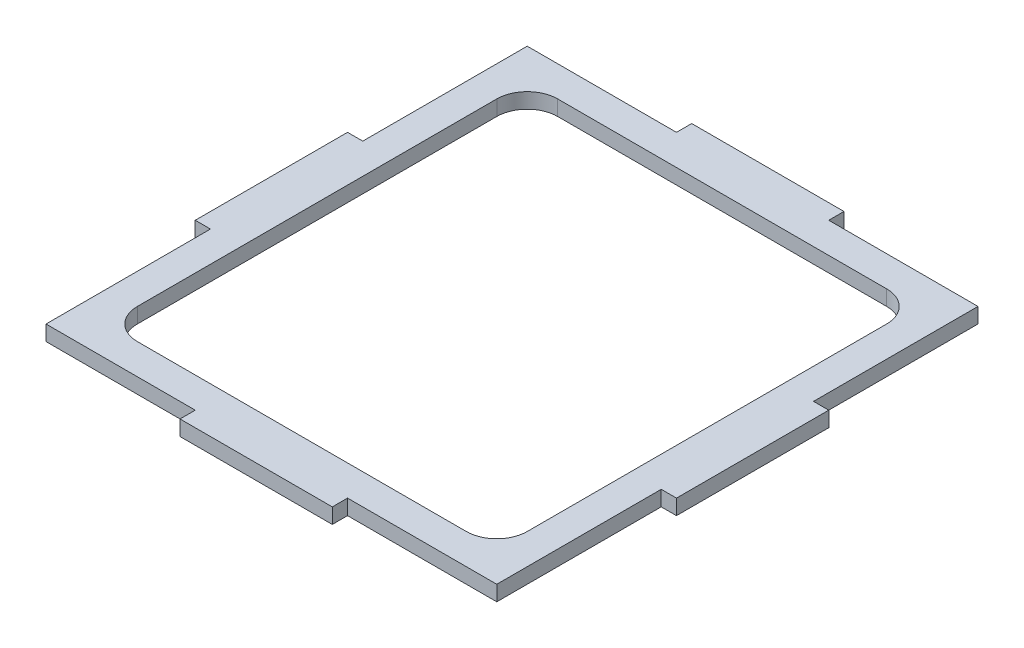
ISO-10303-21;
HEADER;
FILE_DESCRIPTION(('STEP AP214'),'2;1');
FILE_NAME('part.step','',(''),(''),'','','');
FILE_SCHEMA(('AUTOMOTIVE_DESIGN { 1 0 10303 214 1 1 1 1 }'));
ENDSEC;
DATA;
#1=APPLICATION_CONTEXT('core data for automotive mechanical design processes');
#2=APPLICATION_PROTOCOL_DEFINITION('international standard','automotive_design',2000,#1);
#3=PRODUCT_CONTEXT('',#1,'mechanical');
#4=PRODUCT('Part','Part','',(#3));
#5=PRODUCT_RELATED_PRODUCT_CATEGORY('part','',(#4));
#6=PRODUCT_DEFINITION_FORMATION('','',#4);
#7=PRODUCT_DEFINITION_CONTEXT('part definition',#1,'design');
#8=PRODUCT_DEFINITION('design','',#6,#7);
#9=PRODUCT_DEFINITION_SHAPE('','',#8);
#10=(LENGTH_UNIT() NAMED_UNIT(*) SI_UNIT(.MILLI.,.METRE.));
#11=(NAMED_UNIT(*) PLANE_ANGLE_UNIT() SI_UNIT($,.RADIAN.));
#12=(NAMED_UNIT(*) SI_UNIT($,.STERADIAN.) SOLID_ANGLE_UNIT());
#13=UNCERTAINTY_MEASURE_WITH_UNIT(LENGTH_MEASURE(1.E-05),#10,'distance_accuracy_value','');
#14=(GEOMETRIC_REPRESENTATION_CONTEXT(3) GLOBAL_UNCERTAINTY_ASSIGNED_CONTEXT((#13)) GLOBAL_UNIT_ASSIGNED_CONTEXT((#10,
#11,#12)) REPRESENTATION_CONTEXT('',''));
#15=CARTESIAN_POINT('',(0.,0.,0.));
#16=DIRECTION('',(0.,0.,1.));
#17=DIRECTION('',(1.,0.,0.));
#18=AXIS2_PLACEMENT_3D('',#15,#16,#17);
#19=CARTESIAN_POINT('',(-74.,5.,-79.));
#20=DIRECTION('',(0.,0.,1.));
#21=DIRECTION('',(1.,0.,0.));
#22=AXIS2_PLACEMENT_3D('',#19,#20,#21);
#23=PLANE('',#22);
#24=DIRECTION('',(-1.,0.,0.));
#25=VECTOR('',#24,1.);
#26=CARTESIAN_POINT('',(-74.,0.,-79.));
#27=LINE('',#26,#25);
#28=CARTESIAN_POINT('',(74.,0.,-79.));
#29=VERTEX_POINT('',#28);
#30=CARTESIAN_POINT('',(25.,0.,-79.));
#31=VERTEX_POINT('',#30);
#32=EDGE_CURVE('E346',#29,#31,#27,.T.);
#33=ORIENTED_EDGE('',*,*,#32,.T.);
#34=DIRECTION('',(0.,1.,0.));
#35=VECTOR('',#34,1.);
#36=CARTESIAN_POINT('',(25.,5.,-79.));
#37=LINE('',#36,#35);
#38=CARTESIAN_POINT('',(25.,5.,-79.));
#39=VERTEX_POINT('',#38);
#40=EDGE_CURVE('E225',#31,#39,#37,.T.);
#41=ORIENTED_EDGE('',*,*,#40,.T.);
#42=DIRECTION('',(-1.,0.,0.));
#43=VECTOR('',#42,1.);
#44=CARTESIAN_POINT('',(-74.,5.,-79.));
#45=LINE('',#44,#43);
#46=CARTESIAN_POINT('',(74.,5.,-79.));
#47=VERTEX_POINT('',#46);
#48=EDGE_CURVE('E330',#47,#39,#45,.T.);
#49=ORIENTED_EDGE('',*,*,#48,.F.);
#50=DIRECTION('',(0.,-1.,0.));
#51=VECTOR('',#50,1.);
#52=CARTESIAN_POINT('',(74.,5.,-79.));
#53=LINE('',#52,#51);
#54=EDGE_CURVE('E364',#47,#29,#53,.T.);
#55=ORIENTED_EDGE('',*,*,#54,.T.);
#56=EDGE_LOOP('',(#33,#41,#49,#55));
#57=FACE_BOUND('',#56,.T.);
#58=ADVANCED_FACE('F33',(#57),#23,.F.);
#59=CARTESIAN_POINT('',(-74.,5.,79.));
#60=DIRECTION('',(0.,0.,-1.));
#61=DIRECTION('',(-1.,0.,0.));
#62=AXIS2_PLACEMENT_3D('',#59,#60,#61);
#63=PLANE('',#62);
#64=DIRECTION('',(1.,0.,0.));
#65=VECTOR('',#64,1.);
#66=CARTESIAN_POINT('',(-74.,5.,79.));
#67=LINE('',#66,#65);
#68=CARTESIAN_POINT('',(25.,5.,79.));
#69=VERTEX_POINT('',#68);
#70=CARTESIAN_POINT('',(74.,5.,79.));
#71=VERTEX_POINT('',#70);
#72=EDGE_CURVE('E337',#69,#71,#67,.T.);
#73=ORIENTED_EDGE('',*,*,#72,.F.);
#74=DIRECTION('',(0.,-1.,0.));
#75=VECTOR('',#74,1.);
#76=CARTESIAN_POINT('',(25.,5.,79.));
#77=LINE('',#76,#75);
#78=CARTESIAN_POINT('',(25.,0.,79.));
#79=VERTEX_POINT('',#78);
#80=EDGE_CURVE('E274',#69,#79,#77,.T.);
#81=ORIENTED_EDGE('',*,*,#80,.T.);
#82=DIRECTION('',(1.,0.,0.));
#83=VECTOR('',#82,1.);
#84=CARTESIAN_POINT('',(-74.,0.,79.));
#85=LINE('',#84,#83);
#86=CARTESIAN_POINT('',(74.,0.,79.));
#87=VERTEX_POINT('',#86);
#88=EDGE_CURVE('E352',#79,#87,#85,.T.);
#89=ORIENTED_EDGE('',*,*,#88,.T.);
#90=DIRECTION('',(0.,-1.,0.));
#91=VECTOR('',#90,1.);
#92=CARTESIAN_POINT('',(74.,5.,79.));
#93=LINE('',#92,#91);
#94=EDGE_CURVE('E341',#71,#87,#93,.T.);
#95=ORIENTED_EDGE('',*,*,#94,.F.);
#96=EDGE_LOOP('',(#73,#81,#89,#95));
#97=FACE_BOUND('',#96,.T.);
#98=ADVANCED_FACE('F460',(#97),#63,.F.);
#99=CARTESIAN_POINT('',(74.,5.,79.));
#100=DIRECTION('',(-1.,0.,0.));
#101=DIRECTION('',(0.,0.,1.));
#102=AXIS2_PLACEMENT_3D('',#99,#100,#101);
#103=PLANE('',#102);
#104=DIRECTION('',(0.,0.,-1.));
#105=VECTOR('',#104,1.);
#106=CARTESIAN_POINT('',(74.,5.,79.));
#107=LINE('',#106,#105);
#108=CARTESIAN_POINT('',(74.,5.,-25.));
#109=VERTEX_POINT('',#108);
#110=EDGE_CURVE('E329',#109,#47,#107,.T.);
#111=ORIENTED_EDGE('',*,*,#110,.F.);
#112=DIRECTION('',(0.,-1.,0.));
#113=VECTOR('',#112,1.);
#114=CARTESIAN_POINT('',(74.,5.,-25.));
#115=LINE('',#114,#113);
#116=CARTESIAN_POINT('',(74.,0.,-25.));
#117=VERTEX_POINT('',#116);
#118=EDGE_CURVE('E321',#109,#117,#115,.T.);
#119=ORIENTED_EDGE('',*,*,#118,.T.);
#120=DIRECTION('',(0.,0.,-1.));
#121=VECTOR('',#120,1.);
#122=CARTESIAN_POINT('',(74.,0.,79.));
#123=LINE('',#122,#121);
#124=EDGE_CURVE('E324',#117,#29,#123,.T.);
#125=ORIENTED_EDGE('',*,*,#124,.T.);
#126=ORIENTED_EDGE('',*,*,#54,.F.);
#127=EDGE_LOOP('',(#111,#119,#125,#126));
#128=FACE_BOUND('',#127,.T.);
#129=ADVANCED_FACE('F467',(#128),#103,.F.);
#130=CARTESIAN_POINT('',(-74.,5.,79.));
#131=DIRECTION('',(1.,0.,0.));
#132=DIRECTION('',(0.,0.,-1.));
#133=AXIS2_PLACEMENT_3D('',#130,#131,#132);
#134=PLANE('',#133);
#135=DIRECTION('',(0.,0.,1.));
#136=VECTOR('',#135,1.);
#137=CARTESIAN_POINT('',(-74.,0.,79.));
#138=LINE('',#137,#136);
#139=CARTESIAN_POINT('',(-74.,0.,-79.));
#140=VERTEX_POINT('',#139);
#141=CARTESIAN_POINT('',(-74.,0.,-25.));
#142=VERTEX_POINT('',#141);
#143=EDGE_CURVE('E349',#140,#142,#138,.T.);
#144=ORIENTED_EDGE('',*,*,#143,.T.);
#145=DIRECTION('',(0.,1.,0.));
#146=VECTOR('',#145,1.);
#147=CARTESIAN_POINT('',(-74.,5.,-25.));
#148=LINE('',#147,#146);
#149=CARTESIAN_POINT('',(-74.,5.,-25.));
#150=VERTEX_POINT('',#149);
#151=EDGE_CURVE('E318',#142,#150,#148,.T.);
#152=ORIENTED_EDGE('',*,*,#151,.T.);
#153=DIRECTION('',(0.,0.,1.));
#154=VECTOR('',#153,1.);
#155=CARTESIAN_POINT('',(-74.,5.,79.));
#156=LINE('',#155,#154);
#157=CARTESIAN_POINT('',(-74.,5.,-79.));
#158=VERTEX_POINT('',#157);
#159=EDGE_CURVE('E334',#158,#150,#156,.T.);
#160=ORIENTED_EDGE('',*,*,#159,.F.);
#161=DIRECTION('',(0.,-1.,0.));
#162=VECTOR('',#161,1.);
#163=CARTESIAN_POINT('',(-74.,5.,-79.));
#164=LINE('',#163,#162);
#165=EDGE_CURVE('E361',#158,#140,#164,.T.);
#166=ORIENTED_EDGE('',*,*,#165,.T.);
#167=EDGE_LOOP('',(#144,#152,#160,#166));
#168=FACE_BOUND('',#167,.T.);
#169=ADVANCED_FACE('F481',(#168),#134,.F.);
#170=CARTESIAN_POINT('',(74.,0.,25.));
#171=VERTEX_POINT('',#170);
#172=EDGE_CURVE('E342',#87,#171,#123,.T.);
#173=ORIENTED_EDGE('',*,*,#172,.T.);
#174=DIRECTION('',(0.,1.,0.));
#175=VECTOR('',#174,1.);
#176=CARTESIAN_POINT('',(74.,5.,25.));
#177=LINE('',#176,#175);
#178=CARTESIAN_POINT('',(74.,5.,25.));
#179=VERTEX_POINT('',#178);
#180=EDGE_CURVE('E315',#171,#179,#177,.T.);
#181=ORIENTED_EDGE('',*,*,#180,.T.);
#182=EDGE_CURVE('E325',#71,#179,#107,.T.);
#183=ORIENTED_EDGE('',*,*,#182,.F.);
#184=ORIENTED_EDGE('',*,*,#94,.T.);
#185=EDGE_LOOP('',(#173,#181,#183,#184));
#186=FACE_BOUND('',#185,.T.);
#187=ADVANCED_FACE('F474',(#186),#103,.F.);
#188=CARTESIAN_POINT('',(-25.,5.,-79.));
#189=VERTEX_POINT('',#188);
#190=EDGE_CURVE('E328',#189,#158,#45,.T.);
#191=ORIENTED_EDGE('',*,*,#190,.F.);
#192=DIRECTION('',(0.,-1.,0.));
#193=VECTOR('',#192,1.);
#194=CARTESIAN_POINT('',(-25.,5.,-79.));
#195=LINE('',#194,#193);
#196=CARTESIAN_POINT('',(-25.,0.,-79.));
#197=VERTEX_POINT('',#196);
#198=EDGE_CURVE('E271',#189,#197,#195,.T.);
#199=ORIENTED_EDGE('',*,*,#198,.T.);
#200=EDGE_CURVE('E345',#197,#140,#27,.T.);
#201=ORIENTED_EDGE('',*,*,#200,.T.);
#202=ORIENTED_EDGE('',*,*,#165,.F.);
#203=EDGE_LOOP('',(#191,#199,#201,#202));
#204=FACE_BOUND('',#203,.T.);
#205=ADVANCED_FACE('F463',(#204),#23,.F.);
#206=CARTESIAN_POINT('',(-74.,5.,25.));
#207=VERTEX_POINT('',#206);
#208=CARTESIAN_POINT('',(-74.,5.,79.));
#209=VERTEX_POINT('',#208);
#210=EDGE_CURVE('E333',#207,#209,#156,.T.);
#211=ORIENTED_EDGE('',*,*,#210,.F.);
#212=DIRECTION('',(0.,-1.,0.));
#213=VECTOR('',#212,1.);
#214=CARTESIAN_POINT('',(-74.,5.,25.));
#215=LINE('',#214,#213);
#216=CARTESIAN_POINT('',(-74.,0.,25.));
#217=VERTEX_POINT('',#216);
#218=EDGE_CURVE('E306',#207,#217,#215,.T.);
#219=ORIENTED_EDGE('',*,*,#218,.T.);
#220=CARTESIAN_POINT('',(-74.,0.,79.));
#221=VERTEX_POINT('',#220);
#222=EDGE_CURVE('E348',#217,#221,#138,.T.);
#223=ORIENTED_EDGE('',*,*,#222,.T.);
#224=DIRECTION('',(0.,-1.,0.));
#225=VECTOR('',#224,1.);
#226=CARTESIAN_POINT('',(-74.,5.,79.));
#227=LINE('',#226,#225);
#228=EDGE_CURVE('E358',#209,#221,#227,.T.);
#229=ORIENTED_EDGE('',*,*,#228,.F.);
#230=EDGE_LOOP('',(#211,#219,#223,#229));
#231=FACE_BOUND('',#230,.T.);
#232=ADVANCED_FACE('F473',(#231),#134,.F.);
#233=CARTESIAN_POINT('',(-25.,0.,79.));
#234=VERTEX_POINT('',#233);
#235=EDGE_CURVE('E353',#221,#234,#85,.T.);
#236=ORIENTED_EDGE('',*,*,#235,.T.);
#237=DIRECTION('',(0.,1.,0.));
#238=VECTOR('',#237,1.);
#239=CARTESIAN_POINT('',(-25.,5.,79.));
#240=LINE('',#239,#238);
#241=CARTESIAN_POINT('',(-25.,5.,79.));
#242=VERTEX_POINT('',#241);
#243=EDGE_CURVE('E264',#234,#242,#240,.T.);
#244=ORIENTED_EDGE('',*,*,#243,.T.);
#245=EDGE_CURVE('E338',#209,#242,#67,.T.);
#246=ORIENTED_EDGE('',*,*,#245,.F.);
#247=ORIENTED_EDGE('',*,*,#228,.T.);
#248=EDGE_LOOP('',(#236,#244,#246,#247));
#249=FACE_BOUND('',#248,.T.);
#250=ADVANCED_FACE('F470',(#249),#63,.F.);
#251=CARTESIAN_POINT('',(0.,5.,0.));
#252=DIRECTION('',(0.,-1.,0.));
#253=DIRECTION('',(0.,0.,-1.));
#254=AXIS2_PLACEMENT_3D('',#251,#252,#253);
#255=PLANE('',#254);
#256=DIRECTION('',(0.,0.,-1.));
#257=VECTOR('',#256,1.);
#258=CARTESIAN_POINT('',(64.,5.,69.));
#259=LINE('',#258,#257);
#260=CARTESIAN_POINT('',(64.,5.,59.));
#261=VERTEX_POINT('',#260);
#262=CARTESIAN_POINT('',(64.,5.,-59.));
#263=VERTEX_POINT('',#262);
#264=EDGE_CURVE('E409',#261,#263,#259,.T.);
#265=ORIENTED_EDGE('',*,*,#264,.F.);
#266=CARTESIAN_POINT('',(54.,5.,59.));
#267=DIRECTION('',(0.,-1.,0.));
#268=DIRECTION('',(0.,0.,-1.));
#269=AXIS2_PLACEMENT_3D('',#266,#267,#268);
#270=CIRCLE('',#269,10.);
#271=CARTESIAN_POINT('',(54.,5.,69.));
#272=VERTEX_POINT('',#271);
#273=EDGE_CURVE('E390',#261,#272,#270,.T.);
#274=ORIENTED_EDGE('',*,*,#273,.T.);
#275=DIRECTION('',(1.,0.,0.));
#276=VECTOR('',#275,1.);
#277=CARTESIAN_POINT('',(64.,5.,69.));
#278=LINE('',#277,#276);
#279=CARTESIAN_POINT('',(-54.,5.,69.));
#280=VERTEX_POINT('',#279);
#281=EDGE_CURVE('E425',#280,#272,#278,.T.);
#282=ORIENTED_EDGE('',*,*,#281,.F.);
#283=CARTESIAN_POINT('',(-54.,5.,59.));
#284=DIRECTION('',(0.,-1.,0.));
#285=DIRECTION('',(0.,0.,-1.));
#286=AXIS2_PLACEMENT_3D('',#283,#284,#285);
#287=CIRCLE('',#286,10.);
#288=CARTESIAN_POINT('',(-64.,5.,59.));
#289=VERTEX_POINT('',#288);
#290=EDGE_CURVE('E386',#280,#289,#287,.T.);
#291=ORIENTED_EDGE('',*,*,#290,.T.);
#292=DIRECTION('',(0.,0.,1.));
#293=VECTOR('',#292,1.);
#294=CARTESIAN_POINT('',(-64.,5.,69.));
#295=LINE('',#294,#293);
#296=CARTESIAN_POINT('',(-64.,5.,-59.));
#297=VERTEX_POINT('',#296);
#298=EDGE_CURVE('E404',#297,#289,#295,.T.);
#299=ORIENTED_EDGE('',*,*,#298,.F.);
#300=CARTESIAN_POINT('',(-54.,5.,-59.));
#301=DIRECTION('',(0.,-1.,0.));
#302=DIRECTION('',(0.,0.,-1.));
#303=AXIS2_PLACEMENT_3D('',#300,#301,#302);
#304=CIRCLE('',#303,10.);
#305=CARTESIAN_POINT('',(-54.,5.,-69.));
#306=VERTEX_POINT('',#305);
#307=EDGE_CURVE('E41',#297,#306,#304,.T.);
#308=ORIENTED_EDGE('',*,*,#307,.T.);
#309=DIRECTION('',(-1.,0.,0.));
#310=VECTOR('',#309,1.);
#311=CARTESIAN_POINT('',(64.,5.,-69.));
#312=LINE('',#311,#310);
#313=CARTESIAN_POINT('',(54.,5.,-69.));
#314=VERTEX_POINT('',#313);
#315=EDGE_CURVE('E402',#314,#306,#312,.T.);
#316=ORIENTED_EDGE('',*,*,#315,.F.);
#317=CARTESIAN_POINT('',(54.,5.,-59.));
#318=DIRECTION('',(0.,-1.,0.));
#319=DIRECTION('',(0.,0.,-1.));
#320=AXIS2_PLACEMENT_3D('',#317,#318,#319);
#321=CIRCLE('',#320,10.);
#322=EDGE_CURVE('E394',#314,#263,#321,.T.);
#323=ORIENTED_EDGE('',*,*,#322,.T.);
#324=EDGE_LOOP('',(#265,#274,#282,#291,#299,#308,#316,#323));
#325=FACE_BOUND('',#324,.T.);
#326=ORIENTED_EDGE('',*,*,#245,.T.);
#327=DIRECTION('',(0.,0.,1.));
#328=VECTOR('',#327,1.);
#329=CARTESIAN_POINT('',(-25.,5.,84.));
#330=LINE('',#329,#328);
#331=CARTESIAN_POINT('',(-25.,5.,84.));
#332=VERTEX_POINT('',#331);
#333=EDGE_CURVE('E257',#242,#332,#330,.T.);
#334=ORIENTED_EDGE('',*,*,#333,.T.);
#335=DIRECTION('',(1.,0.,0.));
#336=VECTOR('',#335,1.);
#337=CARTESIAN_POINT('',(-25.,5.,84.));
#338=LINE('',#337,#336);
#339=CARTESIAN_POINT('',(25.,5.,84.));
#340=VERTEX_POINT('',#339);
#341=EDGE_CURVE('E231',#332,#340,#338,.T.);
#342=ORIENTED_EDGE('',*,*,#341,.T.);
#343=DIRECTION('',(0.,0.,-1.));
#344=VECTOR('',#343,1.);
#345=CARTESIAN_POINT('',(25.,5.,84.));
#346=LINE('',#345,#344);
#347=EDGE_CURVE('E253',#340,#69,#346,.T.);
#348=ORIENTED_EDGE('',*,*,#347,.T.);
#349=ORIENTED_EDGE('',*,*,#72,.T.);
#350=ORIENTED_EDGE('',*,*,#182,.T.);
#351=DIRECTION('',(1.,0.,0.));
#352=VECTOR('',#351,1.);
#353=CARTESIAN_POINT('',(79.,5.,25.));
#354=LINE('',#353,#352);
#355=CARTESIAN_POINT('',(79.,5.,25.));
#356=VERTEX_POINT('',#355);
#357=EDGE_CURVE('E295',#179,#356,#354,.T.);
#358=ORIENTED_EDGE('',*,*,#357,.T.);
#359=DIRECTION('',(0.,0.,-1.));
#360=VECTOR('',#359,1.);
#361=CARTESIAN_POINT('',(79.,5.,25.));
#362=LINE('',#361,#360);
#363=CARTESIAN_POINT('',(79.,5.,-25.));
#364=VERTEX_POINT('',#363);
#365=EDGE_CURVE('E298',#356,#364,#362,.T.);
#366=ORIENTED_EDGE('',*,*,#365,.T.);
#367=DIRECTION('',(-1.,0.,0.));
#368=VECTOR('',#367,1.);
#369=CARTESIAN_POINT('',(79.,5.,-25.));
#370=LINE('',#369,#368);
#371=EDGE_CURVE('E283',#364,#109,#370,.T.);
#372=ORIENTED_EDGE('',*,*,#371,.T.);
#373=ORIENTED_EDGE('',*,*,#110,.T.);
#374=ORIENTED_EDGE('',*,*,#48,.T.);
#375=CARTESIAN_POINT('',(25.,5.,-84.));
#376=VERTEX_POINT('',#375);
#377=EDGE_CURVE('E255',#39,#376,#346,.T.);
#378=ORIENTED_EDGE('',*,*,#377,.T.);
#379=DIRECTION('',(-1.,0.,0.));
#380=VECTOR('',#379,1.);
#381=CARTESIAN_POINT('',(-25.,5.,-84.));
#382=LINE('',#381,#380);
#383=CARTESIAN_POINT('',(-25.,5.,-84.));
#384=VERTEX_POINT('',#383);
#385=EDGE_CURVE('E238',#376,#384,#382,.T.);
#386=ORIENTED_EDGE('',*,*,#385,.T.);
#387=EDGE_CURVE('E258',#384,#189,#330,.T.);
#388=ORIENTED_EDGE('',*,*,#387,.T.);
#389=ORIENTED_EDGE('',*,*,#190,.T.);
#390=ORIENTED_EDGE('',*,*,#159,.T.);
#391=CARTESIAN_POINT('',(-79.,5.,-25.));
#392=VERTEX_POINT('',#391);
#393=EDGE_CURVE('E301',#150,#392,#370,.T.);
#394=ORIENTED_EDGE('',*,*,#393,.T.);
#395=DIRECTION('',(0.,0.,1.));
#396=VECTOR('',#395,1.);
#397=CARTESIAN_POINT('',(-79.,5.,25.));
#398=LINE('',#397,#396);
#399=CARTESIAN_POINT('',(-79.,5.,25.));
#400=VERTEX_POINT('',#399);
#401=EDGE_CURVE('E278',#392,#400,#398,.T.);
#402=ORIENTED_EDGE('',*,*,#401,.T.);
#403=EDGE_CURVE('E296',#400,#207,#354,.T.);
#404=ORIENTED_EDGE('',*,*,#403,.T.);
#405=ORIENTED_EDGE('',*,*,#210,.T.);
#406=EDGE_LOOP('',(#326,#334,#342,#348,#349,#350,#358,#366,#372,#373,#374,#378,#386,#388,#389,
#390,#394,#402,#404,#405));
#407=FACE_BOUND('',#406,.T.);
#408=ADVANCED_FACE('F400',(#325,#407),#255,.F.);
#409=CARTESIAN_POINT('',(0.,0.,0.));
#410=DIRECTION('',(0.,-1.,0.));
#411=DIRECTION('',(0.,0.,-1.));
#412=AXIS2_PLACEMENT_3D('',#409,#410,#411);
#413=PLANE('',#412);
#414=DIRECTION('',(0.,0.,1.));
#415=VECTOR('',#414,1.);
#416=CARTESIAN_POINT('',(-64.,0.,69.));
#417=LINE('',#416,#415);
#418=CARTESIAN_POINT('',(-64.,0.,-59.));
#419=VERTEX_POINT('',#418);
#420=CARTESIAN_POINT('',(-64.,0.,59.));
#421=VERTEX_POINT('',#420);
#422=EDGE_CURVE('E414',#419,#421,#417,.T.);
#423=ORIENTED_EDGE('',*,*,#422,.T.);
#424=CARTESIAN_POINT('',(-54.,0.,59.));
#425=DIRECTION('',(0.,-1.,0.));
#426=DIRECTION('',(0.,0.,-1.));
#427=AXIS2_PLACEMENT_3D('',#424,#425,#426);
#428=CIRCLE('',#427,10.);
#429=CARTESIAN_POINT('',(-54.,0.,69.));
#430=VERTEX_POINT('',#429);
#431=EDGE_CURVE('E388',#421,#430,#428,.F.);
#432=ORIENTED_EDGE('',*,*,#431,.T.);
#433=DIRECTION('',(1.,0.,0.));
#434=VECTOR('',#433,1.);
#435=CARTESIAN_POINT('',(64.,0.,69.));
#436=LINE('',#435,#434);
#437=CARTESIAN_POINT('',(54.,0.,69.));
#438=VERTEX_POINT('',#437);
#439=EDGE_CURVE('E429',#430,#438,#436,.T.);
#440=ORIENTED_EDGE('',*,*,#439,.T.);
#441=CARTESIAN_POINT('',(54.,0.,59.));
#442=DIRECTION('',(0.,-1.,0.));
#443=DIRECTION('',(0.,0.,-1.));
#444=AXIS2_PLACEMENT_3D('',#441,#442,#443);
#445=CIRCLE('',#444,10.);
#446=CARTESIAN_POINT('',(64.,0.,59.));
#447=VERTEX_POINT('',#446);
#448=EDGE_CURVE('E392',#438,#447,#445,.F.);
#449=ORIENTED_EDGE('',*,*,#448,.T.);
#450=DIRECTION('',(0.,0.,-1.));
#451=VECTOR('',#450,1.);
#452=CARTESIAN_POINT('',(64.,0.,69.));
#453=LINE('',#452,#451);
#454=CARTESIAN_POINT('',(64.,0.,-59.));
#455=VERTEX_POINT('',#454);
#456=EDGE_CURVE('E421',#447,#455,#453,.T.);
#457=ORIENTED_EDGE('',*,*,#456,.T.);
#458=CARTESIAN_POINT('',(54.,0.,-59.));
#459=DIRECTION('',(0.,-1.,0.));
#460=DIRECTION('',(0.,0.,-1.));
#461=AXIS2_PLACEMENT_3D('',#458,#459,#460);
#462=CIRCLE('',#461,10.);
#463=CARTESIAN_POINT('',(54.,0.,-69.));
#464=VERTEX_POINT('',#463);
#465=EDGE_CURVE('E55',#455,#464,#462,.F.);
#466=ORIENTED_EDGE('',*,*,#465,.T.);
#467=DIRECTION('',(-1.,0.,0.));
#468=VECTOR('',#467,1.);
#469=CARTESIAN_POINT('',(64.,0.,-69.));
#470=LINE('',#469,#468);
#471=CARTESIAN_POINT('',(-54.,0.,-69.));
#472=VERTEX_POINT('',#471);
#473=EDGE_CURVE('E416',#464,#472,#470,.T.);
#474=ORIENTED_EDGE('',*,*,#473,.T.);
#475=CARTESIAN_POINT('',(-54.,0.,-59.));
#476=DIRECTION('',(0.,-1.,0.));
#477=DIRECTION('',(0.,0.,-1.));
#478=AXIS2_PLACEMENT_3D('',#475,#476,#477);
#479=CIRCLE('',#478,10.);
#480=EDGE_CURVE('E11',#472,#419,#479,.F.);
#481=ORIENTED_EDGE('',*,*,#480,.T.);
#482=EDGE_LOOP('',(#423,#432,#440,#449,#457,#466,#474,#481));
#483=FACE_BOUND('',#482,.T.);
#484=ORIENTED_EDGE('',*,*,#200,.F.);
#485=DIRECTION('',(0.,0.,1.));
#486=VECTOR('',#485,1.);
#487=CARTESIAN_POINT('',(-25.,0.,84.));
#488=LINE('',#487,#486);
#489=CARTESIAN_POINT('',(-25.,0.,-84.));
#490=VERTEX_POINT('',#489);
#491=EDGE_CURVE('E245',#490,#197,#488,.T.);
#492=ORIENTED_EDGE('',*,*,#491,.F.);
#493=DIRECTION('',(-1.,0.,0.));
#494=VECTOR('',#493,1.);
#495=CARTESIAN_POINT('',(-25.,0.,-84.));
#496=LINE('',#495,#494);
#497=CARTESIAN_POINT('',(25.,0.,-84.));
#498=VERTEX_POINT('',#497);
#499=EDGE_CURVE('E236',#498,#490,#496,.T.);
#500=ORIENTED_EDGE('',*,*,#499,.F.);
#501=DIRECTION('',(0.,0.,-1.));
#502=VECTOR('',#501,1.);
#503=CARTESIAN_POINT('',(25.,0.,84.));
#504=LINE('',#503,#502);
#505=EDGE_CURVE('E219',#31,#498,#504,.T.);
#506=ORIENTED_EDGE('',*,*,#505,.F.);
#507=ORIENTED_EDGE('',*,*,#32,.F.);
#508=ORIENTED_EDGE('',*,*,#124,.F.);
#509=DIRECTION('',(-1.,0.,0.));
#510=VECTOR('',#509,1.);
#511=CARTESIAN_POINT('',(79.,0.,-25.));
#512=LINE('',#511,#510);
#513=CARTESIAN_POINT('',(79.,0.,-25.));
#514=VERTEX_POINT('',#513);
#515=EDGE_CURVE('E290',#514,#117,#512,.T.);
#516=ORIENTED_EDGE('',*,*,#515,.F.);
#517=DIRECTION('',(0.,0.,-1.));
#518=VECTOR('',#517,1.);
#519=CARTESIAN_POINT('',(79.,0.,25.));
#520=LINE('',#519,#518);
#521=CARTESIAN_POINT('',(79.,0.,25.));
#522=VERTEX_POINT('',#521);
#523=EDGE_CURVE('E286',#522,#514,#520,.T.);
#524=ORIENTED_EDGE('',*,*,#523,.F.);
#525=DIRECTION('',(1.,0.,0.));
#526=VECTOR('',#525,1.);
#527=CARTESIAN_POINT('',(79.,0.,25.));
#528=LINE('',#527,#526);
#529=EDGE_CURVE('E282',#171,#522,#528,.T.);
#530=ORIENTED_EDGE('',*,*,#529,.F.);
#531=ORIENTED_EDGE('',*,*,#172,.F.);
#532=ORIENTED_EDGE('',*,*,#88,.F.);
#533=CARTESIAN_POINT('',(25.,0.,84.));
#534=VERTEX_POINT('',#533);
#535=EDGE_CURVE('E230',#534,#79,#504,.T.);
#536=ORIENTED_EDGE('',*,*,#535,.F.);
#537=DIRECTION('',(1.,0.,0.));
#538=VECTOR('',#537,1.);
#539=CARTESIAN_POINT('',(-25.,0.,84.));
#540=LINE('',#539,#538);
#541=CARTESIAN_POINT('',(-25.,0.,84.));
#542=VERTEX_POINT('',#541);
#543=EDGE_CURVE('E240',#542,#534,#540,.T.);
#544=ORIENTED_EDGE('',*,*,#543,.F.);
#545=EDGE_CURVE('E246',#234,#542,#488,.T.);
#546=ORIENTED_EDGE('',*,*,#545,.F.);
#547=ORIENTED_EDGE('',*,*,#235,.F.);
#548=ORIENTED_EDGE('',*,*,#222,.F.);
#549=CARTESIAN_POINT('',(-79.,0.,25.));
#550=VERTEX_POINT('',#549);
#551=EDGE_CURVE('E284',#550,#217,#528,.T.);
#552=ORIENTED_EDGE('',*,*,#551,.F.);
#553=DIRECTION('',(0.,0.,1.));
#554=VECTOR('',#553,1.);
#555=CARTESIAN_POINT('',(-79.,0.,25.));
#556=LINE('',#555,#554);
#557=CARTESIAN_POINT('',(-79.,0.,-25.));
#558=VERTEX_POINT('',#557);
#559=EDGE_CURVE('E279',#558,#550,#556,.T.);
#560=ORIENTED_EDGE('',*,*,#559,.F.);
#561=EDGE_CURVE('E289',#142,#558,#512,.T.);
#562=ORIENTED_EDGE('',*,*,#561,.F.);
#563=ORIENTED_EDGE('',*,*,#143,.F.);
#564=EDGE_LOOP('',(#484,#492,#500,#506,#507,#508,#516,#524,#530,#531,#532,#536,#544,#546,#547,
#548,#552,#560,#562,#563));
#565=FACE_BOUND('',#564,.T.);
#566=ADVANCED_FACE('F244',(#483,#565),#413,.T.);
#567=CARTESIAN_POINT('',(-79.,0.,25.));
#568=DIRECTION('',(-1.,0.,0.));
#569=DIRECTION('',(0.,0.,1.));
#570=AXIS2_PLACEMENT_3D('',#567,#568,#569);
#571=PLANE('',#570);
#572=ORIENTED_EDGE('',*,*,#401,.F.);
#573=DIRECTION('',(0.,1.,0.));
#574=VECTOR('',#573,1.);
#575=CARTESIAN_POINT('',(-79.,0.,-25.));
#576=LINE('',#575,#574);
#577=EDGE_CURVE('E303',#558,#392,#576,.T.);
#578=ORIENTED_EDGE('',*,*,#577,.F.);
#579=ORIENTED_EDGE('',*,*,#559,.T.);
#580=DIRECTION('',(0.,1.,0.));
#581=VECTOR('',#580,1.);
#582=CARTESIAN_POINT('',(-79.,0.,25.));
#583=LINE('',#582,#581);
#584=EDGE_CURVE('E292',#550,#400,#583,.T.);
#585=ORIENTED_EDGE('',*,*,#584,.T.);
#586=EDGE_LOOP('',(#572,#578,#579,#585));
#587=FACE_BOUND('',#586,.T.);
#588=ADVANCED_FACE('F529',(#587),#571,.T.);
#589=CARTESIAN_POINT('',(79.,0.,25.));
#590=DIRECTION('',(0.,0.,1.));
#591=DIRECTION('',(1.,0.,0.));
#592=AXIS2_PLACEMENT_3D('',#589,#590,#591);
#593=PLANE('',#592);
#594=ORIENTED_EDGE('',*,*,#218,.F.);
#595=ORIENTED_EDGE('',*,*,#403,.F.);
#596=ORIENTED_EDGE('',*,*,#584,.F.);
#597=ORIENTED_EDGE('',*,*,#551,.T.);
#598=EDGE_LOOP('',(#594,#595,#596,#597));
#599=FACE_BOUND('',#598,.T.);
#600=ADVANCED_FACE('F548',(#599),#593,.T.);
#601=CARTESIAN_POINT('',(79.,0.,-25.));
#602=DIRECTION('',(0.,0.,-1.));
#603=DIRECTION('',(-1.,0.,0.));
#604=AXIS2_PLACEMENT_3D('',#601,#602,#603);
#605=PLANE('',#604);
#606=ORIENTED_EDGE('',*,*,#151,.F.);
#607=ORIENTED_EDGE('',*,*,#561,.T.);
#608=ORIENTED_EDGE('',*,*,#577,.T.);
#609=ORIENTED_EDGE('',*,*,#393,.F.);
#610=EDGE_LOOP('',(#606,#607,#608,#609));
#611=FACE_BOUND('',#610,.T.);
#612=ADVANCED_FACE('F532',(#611),#605,.T.);
#613=ORIENTED_EDGE('',*,*,#118,.F.);
#614=ORIENTED_EDGE('',*,*,#371,.F.);
#615=DIRECTION('',(0.,1.,0.));
#616=VECTOR('',#615,1.);
#617=CARTESIAN_POINT('',(79.,0.,-25.));
#618=LINE('',#617,#616);
#619=EDGE_CURVE('E307',#514,#364,#618,.T.);
#620=ORIENTED_EDGE('',*,*,#619,.F.);
#621=ORIENTED_EDGE('',*,*,#515,.T.);
#622=EDGE_LOOP('',(#613,#614,#620,#621));
#623=FACE_BOUND('',#622,.T.);
#624=ADVANCED_FACE('F552',(#623),#605,.T.);
#625=ORIENTED_EDGE('',*,*,#180,.F.);
#626=ORIENTED_EDGE('',*,*,#529,.T.);
#627=DIRECTION('',(0.,1.,0.));
#628=VECTOR('',#627,1.);
#629=CARTESIAN_POINT('',(79.,0.,25.));
#630=LINE('',#629,#628);
#631=EDGE_CURVE('E309',#522,#356,#630,.T.);
#632=ORIENTED_EDGE('',*,*,#631,.T.);
#633=ORIENTED_EDGE('',*,*,#357,.F.);
#634=EDGE_LOOP('',(#625,#626,#632,#633));
#635=FACE_BOUND('',#634,.T.);
#636=ADVANCED_FACE('F549',(#635),#593,.T.);
#637=CARTESIAN_POINT('',(79.,0.,25.));
#638=DIRECTION('',(1.,0.,0.));
#639=DIRECTION('',(0.,0.,-1.));
#640=AXIS2_PLACEMENT_3D('',#637,#638,#639);
#641=PLANE('',#640);
#642=ORIENTED_EDGE('',*,*,#365,.F.);
#643=ORIENTED_EDGE('',*,*,#631,.F.);
#644=ORIENTED_EDGE('',*,*,#523,.T.);
#645=ORIENTED_EDGE('',*,*,#619,.T.);
#646=EDGE_LOOP('',(#642,#643,#644,#645));
#647=FACE_BOUND('',#646,.T.);
#648=ADVANCED_FACE('F509',(#647),#641,.T.);
#649=CARTESIAN_POINT('',(-25.,0.,84.));
#650=DIRECTION('',(0.,0.,1.));
#651=DIRECTION('',(1.,0.,0.));
#652=AXIS2_PLACEMENT_3D('',#649,#650,#651);
#653=PLANE('',#652);
#654=ORIENTED_EDGE('',*,*,#341,.F.);
#655=DIRECTION('',(0.,1.,0.));
#656=VECTOR('',#655,1.);
#657=CARTESIAN_POINT('',(-25.,0.,84.));
#658=LINE('',#657,#656);
#659=EDGE_CURVE('E265',#542,#332,#658,.T.);
#660=ORIENTED_EDGE('',*,*,#659,.F.);
#661=ORIENTED_EDGE('',*,*,#543,.T.);
#662=DIRECTION('',(0.,1.,0.));
#663=VECTOR('',#662,1.);
#664=CARTESIAN_POINT('',(25.,0.,84.));
#665=LINE('',#664,#663);
#666=EDGE_CURVE('E262',#534,#340,#665,.T.);
#667=ORIENTED_EDGE('',*,*,#666,.T.);
#668=EDGE_LOOP('',(#654,#660,#661,#667));
#669=FACE_BOUND('',#668,.T.);
#670=ADVANCED_FACE('F502',(#669),#653,.T.);
#671=CARTESIAN_POINT('',(-25.,0.,84.));
#672=DIRECTION('',(-1.,0.,0.));
#673=DIRECTION('',(0.,0.,1.));
#674=AXIS2_PLACEMENT_3D('',#671,#672,#673);
#675=PLANE('',#674);
#676=ORIENTED_EDGE('',*,*,#243,.F.);
#677=ORIENTED_EDGE('',*,*,#545,.T.);
#678=ORIENTED_EDGE('',*,*,#659,.T.);
#679=ORIENTED_EDGE('',*,*,#333,.F.);
#680=EDGE_LOOP('',(#676,#677,#678,#679));
#681=FACE_BOUND('',#680,.T.);
#682=ADVANCED_FACE('F492',(#681),#675,.T.);
#683=CARTESIAN_POINT('',(25.,0.,84.));
#684=DIRECTION('',(1.,0.,0.));
#685=DIRECTION('',(0.,0.,-1.));
#686=AXIS2_PLACEMENT_3D('',#683,#684,#685);
#687=PLANE('',#686);
#688=ORIENTED_EDGE('',*,*,#80,.F.);
#689=ORIENTED_EDGE('',*,*,#347,.F.);
#690=ORIENTED_EDGE('',*,*,#666,.F.);
#691=ORIENTED_EDGE('',*,*,#535,.T.);
#692=EDGE_LOOP('',(#688,#689,#690,#691));
#693=FACE_BOUND('',#692,.T.);
#694=ADVANCED_FACE('F498',(#693),#687,.T.);
#695=ORIENTED_EDGE('',*,*,#40,.F.);
#696=ORIENTED_EDGE('',*,*,#505,.T.);
#697=DIRECTION('',(0.,1.,0.));
#698=VECTOR('',#697,1.);
#699=CARTESIAN_POINT('',(25.,0.,-84.));
#700=LINE('',#699,#698);
#701=EDGE_CURVE('E222',#498,#376,#700,.T.);
#702=ORIENTED_EDGE('',*,*,#701,.T.);
#703=ORIENTED_EDGE('',*,*,#377,.F.);
#704=EDGE_LOOP('',(#695,#696,#702,#703));
#705=FACE_BOUND('',#704,.T.);
#706=ADVANCED_FACE('F221',(#705),#687,.T.);
#707=ORIENTED_EDGE('',*,*,#198,.F.);
#708=ORIENTED_EDGE('',*,*,#387,.F.);
#709=DIRECTION('',(0.,1.,0.));
#710=VECTOR('',#709,1.);
#711=CARTESIAN_POINT('',(-25.,0.,-84.));
#712=LINE('',#711,#710);
#713=EDGE_CURVE('E239',#490,#384,#712,.T.);
#714=ORIENTED_EDGE('',*,*,#713,.F.);
#715=ORIENTED_EDGE('',*,*,#491,.T.);
#716=EDGE_LOOP('',(#707,#708,#714,#715));
#717=FACE_BOUND('',#716,.T.);
#718=ADVANCED_FACE('F489',(#717),#675,.T.);
#719=CARTESIAN_POINT('',(-25.,0.,-84.));
#720=DIRECTION('',(0.,0.,-1.));
#721=DIRECTION('',(-1.,0.,0.));
#722=AXIS2_PLACEMENT_3D('',#719,#720,#721);
#723=PLANE('',#722);
#724=ORIENTED_EDGE('',*,*,#385,.F.);
#725=ORIENTED_EDGE('',*,*,#701,.F.);
#726=ORIENTED_EDGE('',*,*,#499,.T.);
#727=ORIENTED_EDGE('',*,*,#713,.T.);
#728=EDGE_LOOP('',(#724,#725,#726,#727));
#729=FACE_BOUND('',#728,.T.);
#730=ADVANCED_FACE('F235',(#729),#723,.T.);
#731=CARTESIAN_POINT('',(64.,0.,69.));
#732=DIRECTION('',(0.,0.,1.));
#733=DIRECTION('',(1.,0.,0.));
#734=AXIS2_PLACEMENT_3D('',#731,#732,#733);
#735=PLANE('',#734);
#736=ORIENTED_EDGE('',*,*,#439,.F.);
#737=DIRECTION('',(0.,1.,0.));
#738=VECTOR('',#737,1.);
#739=CARTESIAN_POINT('',(-54.,5.,69.));
#740=LINE('',#739,#738);
#741=EDGE_CURVE('E369',#430,#280,#740,.T.);
#742=ORIENTED_EDGE('',*,*,#741,.T.);
#743=ORIENTED_EDGE('',*,*,#281,.T.);
#744=DIRECTION('',(0.,1.,0.));
#745=VECTOR('',#744,1.);
#746=CARTESIAN_POINT('',(54.,0.,69.));
#747=LINE('',#746,#745);
#748=EDGE_CURVE('E367',#272,#438,#747,.F.);
#749=ORIENTED_EDGE('',*,*,#748,.T.);
#750=EDGE_LOOP('',(#736,#742,#743,#749));
#751=FACE_BOUND('',#750,.T.);
#752=ADVANCED_FACE('F446',(#751),#735,.F.);
#753=CARTESIAN_POINT('',(-64.,0.,69.));
#754=DIRECTION('',(-1.,0.,0.));
#755=DIRECTION('',(0.,0.,1.));
#756=AXIS2_PLACEMENT_3D('',#753,#754,#755);
#757=PLANE('',#756);
#758=ORIENTED_EDGE('',*,*,#298,.T.);
#759=DIRECTION('',(0.,1.,0.));
#760=VECTOR('',#759,1.);
#761=CARTESIAN_POINT('',(-64.,0.,59.));
#762=LINE('',#761,#760);
#763=EDGE_CURVE('E375',#289,#421,#762,.F.);
#764=ORIENTED_EDGE('',*,*,#763,.T.);
#765=ORIENTED_EDGE('',*,*,#422,.F.);
#766=DIRECTION('',(0.,1.,0.));
#767=VECTOR('',#766,1.);
#768=CARTESIAN_POINT('',(-64.,5.,-59.));
#769=LINE('',#768,#767);
#770=EDGE_CURVE('E372',#419,#297,#769,.T.);
#771=ORIENTED_EDGE('',*,*,#770,.T.);
#772=EDGE_LOOP('',(#758,#764,#765,#771));
#773=FACE_BOUND('',#772,.T.);
#774=ADVANCED_FACE('F418',(#773),#757,.F.);
#775=CARTESIAN_POINT('',(64.,0.,-69.));
#776=DIRECTION('',(0.,0.,-1.));
#777=DIRECTION('',(-1.,0.,0.));
#778=AXIS2_PLACEMENT_3D('',#775,#776,#777);
#779=PLANE('',#778);
#780=ORIENTED_EDGE('',*,*,#473,.F.);
#781=DIRECTION('',(0.,1.,0.));
#782=VECTOR('',#781,1.);
#783=CARTESIAN_POINT('',(54.,5.,-69.));
#784=LINE('',#783,#782);
#785=EDGE_CURVE('E383',#464,#314,#784,.T.);
#786=ORIENTED_EDGE('',*,*,#785,.T.);
#787=ORIENTED_EDGE('',*,*,#315,.T.);
#788=DIRECTION('',(0.,1.,0.));
#789=VECTOR('',#788,1.);
#790=CARTESIAN_POINT('',(-54.,0.,-69.));
#791=LINE('',#790,#789);
#792=EDGE_CURVE('E48',#306,#472,#791,.F.);
#793=ORIENTED_EDGE('',*,*,#792,.T.);
#794=EDGE_LOOP('',(#780,#786,#787,#793));
#795=FACE_BOUND('',#794,.T.);
#796=ADVANCED_FACE('F407',(#795),#779,.F.);
#797=CARTESIAN_POINT('',(64.,0.,69.));
#798=DIRECTION('',(1.,0.,0.));
#799=DIRECTION('',(0.,0.,-1.));
#800=AXIS2_PLACEMENT_3D('',#797,#798,#799);
#801=PLANE('',#800);
#802=ORIENTED_EDGE('',*,*,#456,.F.);
#803=DIRECTION('',(0.,1.,0.));
#804=VECTOR('',#803,1.);
#805=CARTESIAN_POINT('',(64.,5.,59.));
#806=LINE('',#805,#804);
#807=EDGE_CURVE('E379',#447,#261,#806,.T.);
#808=ORIENTED_EDGE('',*,*,#807,.T.);
#809=ORIENTED_EDGE('',*,*,#264,.T.);
#810=DIRECTION('',(0.,1.,0.));
#811=VECTOR('',#810,1.);
#812=CARTESIAN_POINT('',(64.,0.,-59.));
#813=LINE('',#812,#811);
#814=EDGE_CURVE('E377',#263,#455,#813,.F.);
#815=ORIENTED_EDGE('',*,*,#814,.T.);
#816=EDGE_LOOP('',(#802,#808,#809,#815));
#817=FACE_BOUND('',#816,.T.);
#818=ADVANCED_FACE('F440',(#817),#801,.F.);
#819=CARTESIAN_POINT('',(-54.,0.,59.));
#820=DIRECTION('',(0.,-1.,0.));
#821=DIRECTION('',(0.,0.,-1.));
#822=AXIS2_PLACEMENT_3D('',#819,#820,#821);
#823=CYLINDRICAL_SURFACE('',#822,10.);
#824=ORIENTED_EDGE('',*,*,#431,.F.);
#825=ORIENTED_EDGE('',*,*,#763,.F.);
#826=ORIENTED_EDGE('',*,*,#290,.F.);
#827=ORIENTED_EDGE('',*,*,#741,.F.);
#828=EDGE_LOOP('',(#824,#825,#826,#827));
#829=FACE_BOUND('',#828,.T.);
#830=ADVANCED_FACE('F449',(#829),#823,.F.);
#831=CARTESIAN_POINT('',(54.,0.,59.));
#832=DIRECTION('',(0.,-1.,0.));
#833=DIRECTION('',(0.,0.,-1.));
#834=AXIS2_PLACEMENT_3D('',#831,#832,#833);
#835=CYLINDRICAL_SURFACE('',#834,10.);
#836=ORIENTED_EDGE('',*,*,#448,.F.);
#837=ORIENTED_EDGE('',*,*,#748,.F.);
#838=ORIENTED_EDGE('',*,*,#273,.F.);
#839=ORIENTED_EDGE('',*,*,#807,.F.);
#840=EDGE_LOOP('',(#836,#837,#838,#839));
#841=FACE_BOUND('',#840,.T.);
#842=ADVANCED_FACE('F442',(#841),#835,.F.);
#843=CARTESIAN_POINT('',(54.,0.,-59.));
#844=DIRECTION('',(0.,-1.,0.));
#845=DIRECTION('',(0.,0.,-1.));
#846=AXIS2_PLACEMENT_3D('',#843,#844,#845);
#847=CYLINDRICAL_SURFACE('',#846,10.);
#848=ORIENTED_EDGE('',*,*,#465,.F.);
#849=ORIENTED_EDGE('',*,*,#814,.F.);
#850=ORIENTED_EDGE('',*,*,#322,.F.);
#851=ORIENTED_EDGE('',*,*,#785,.F.);
#852=EDGE_LOOP('',(#848,#849,#850,#851));
#853=FACE_BOUND('',#852,.T.);
#854=ADVANCED_FACE('F439',(#853),#847,.F.);
#855=CARTESIAN_POINT('',(-54.,0.,-59.));
#856=DIRECTION('',(0.,-1.,0.));
#857=DIRECTION('',(0.,0.,-1.));
#858=AXIS2_PLACEMENT_3D('',#855,#856,#857);
#859=CYLINDRICAL_SURFACE('',#858,10.);
#860=ORIENTED_EDGE('',*,*,#480,.F.);
#861=ORIENTED_EDGE('',*,*,#792,.F.);
#862=ORIENTED_EDGE('',*,*,#307,.F.);
#863=ORIENTED_EDGE('',*,*,#770,.F.);
#864=EDGE_LOOP('',(#860,#861,#862,#863));
#865=FACE_BOUND('',#864,.T.);
#866=ADVANCED_FACE('F35',(#865),#859,.F.);
#867=CLOSED_SHELL('',(#58,#98,#129,#169,#187,#205,#232,#250,#408,#566,#588,#600,#612,#624,#636,
#648,#670,#682,#694,#706,#718,#730,#752,#774,#796,#818,#830,#842,#854,#866));
#868=MANIFOLD_SOLID_BREP('B2',#867);
#869=ADVANCED_BREP_SHAPE_REPRESENTATION('',(#18,#868),#14);
#870=SHAPE_DEFINITION_REPRESENTATION(#9,#869);
ENDSEC;
END-ISO-10303-21;
